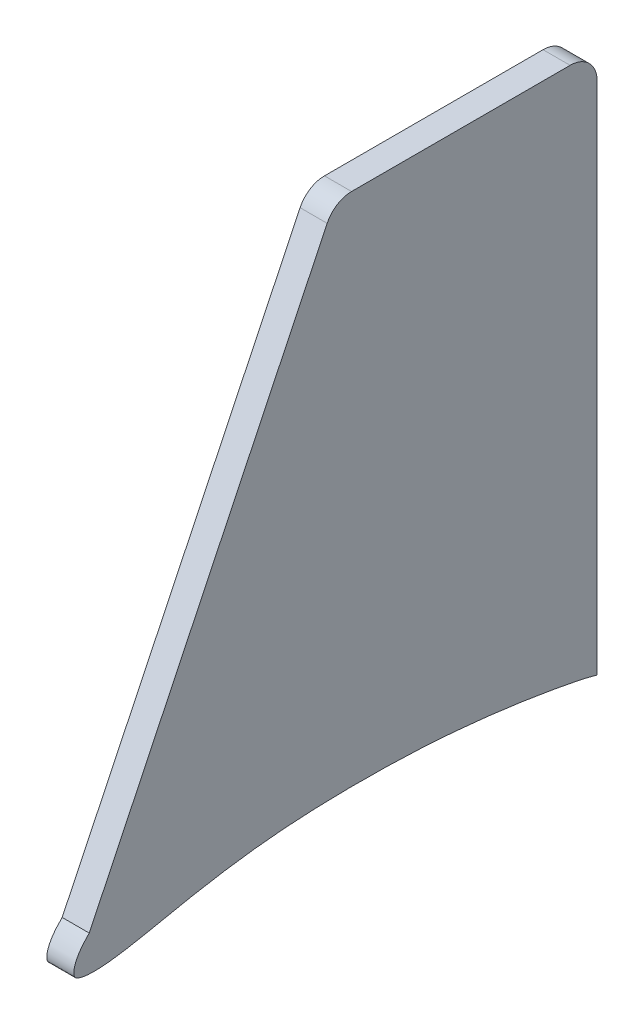
ISO-10303-21;
HEADER;
FILE_DESCRIPTION(('STEP AP214'),'2;1');
FILE_NAME('part.step','',(''),(''),'','','');
FILE_SCHEMA(('AUTOMOTIVE_DESIGN { 1 0 10303 214 1 1 1 1 }'));
ENDSEC;
DATA;
#1=APPLICATION_CONTEXT('core data for automotive mechanical design processes');
#2=APPLICATION_PROTOCOL_DEFINITION('international standard','automotive_design',2000,#1);
#3=PRODUCT_CONTEXT('',#1,'mechanical');
#4=PRODUCT('Part','Part','',(#3));
#5=PRODUCT_RELATED_PRODUCT_CATEGORY('part','',(#4));
#6=PRODUCT_DEFINITION_FORMATION('','',#4);
#7=PRODUCT_DEFINITION_CONTEXT('part definition',#1,'design');
#8=PRODUCT_DEFINITION('design','',#6,#7);
#9=PRODUCT_DEFINITION_SHAPE('','',#8);
#10=(LENGTH_UNIT() NAMED_UNIT(*) SI_UNIT(.MILLI.,.METRE.));
#11=(NAMED_UNIT(*) PLANE_ANGLE_UNIT() SI_UNIT($,.RADIAN.));
#12=(NAMED_UNIT(*) SI_UNIT($,.STERADIAN.) SOLID_ANGLE_UNIT());
#13=UNCERTAINTY_MEASURE_WITH_UNIT(LENGTH_MEASURE(1.E-05),#10,'distance_accuracy_value','');
#14=(GEOMETRIC_REPRESENTATION_CONTEXT(3) GLOBAL_UNCERTAINTY_ASSIGNED_CONTEXT((#13)) GLOBAL_UNIT_ASSIGNED_CONTEXT((#10,
#11,#12)) REPRESENTATION_CONTEXT('',''));
#15=CARTESIAN_POINT('',(0.,0.,0.));
#16=DIRECTION('',(0.,0.,1.));
#17=DIRECTION('',(1.,0.,0.));
#18=AXIS2_PLACEMENT_3D('',#15,#16,#17);
#19=CARTESIAN_POINT('',(10.,75.2925877763329,156.85955786736));
#20=DIRECTION('',(0.,0.432731067584771,0.901523057468274));
#21=DIRECTION('',(0.,-0.901523057468274,0.432731067584771));
#22=AXIS2_PLACEMENT_3D('',#19,#20,#21);
#23=PLANE('',#22);
#24=DIRECTION('',(0.,0.901523057468274,-0.432731067584771));
#25=VECTOR('',#24,1.);
#26=CARTESIAN_POINT('',(10.,75.2925877763329,156.85955786736));
#27=LINE('',#26,#25);
#28=CARTESIAN_POINT('',(10.,11.2681467861031,187.59128954267));
#29=VERTEX_POINT('',#28);
#30=CARTESIAN_POINT('',(10.,194.327310675848,99.7228908755931));
#31=VERTEX_POINT('',#30);
#32=EDGE_CURVE('E95',#29,#31,#27,.T.);
#33=ORIENTED_EDGE('',*,*,#32,.T.);
#34=DIRECTION('',(-1.,0.,0.));
#35=VECTOR('',#34,1.);
#36=CARTESIAN_POINT('',(10.,194.327310675848,99.7228908755931));
#37=LINE('',#36,#35);
#38=CARTESIAN_POINT('',(0.,194.327310675848,99.7228908755931));
#39=VERTEX_POINT('',#38);
#40=EDGE_CURVE('E102',#31,#39,#37,.T.);
#41=ORIENTED_EDGE('',*,*,#40,.T.);
#42=DIRECTION('',(0.,0.901523057468274,-0.432731067584771));
#43=VECTOR('',#42,1.);
#44=CARTESIAN_POINT('',(0.,75.2925877763329,156.85955786736));
#45=LINE('',#44,#43);
#46=CARTESIAN_POINT('',(0.,11.2681467861031,187.59128954267));
#47=VERTEX_POINT('',#46);
#48=EDGE_CURVE('E98',#47,#39,#45,.T.);
#49=ORIENTED_EDGE('',*,*,#48,.F.);
#50=DIRECTION('',(-1.,0.,0.));
#51=VECTOR('',#50,1.);
#52=CARTESIAN_POINT('',(10.,11.2681467861031,187.59128954267));
#53=LINE('',#52,#51);
#54=EDGE_CURVE('E91',#29,#47,#53,.T.);
#55=ORIENTED_EDGE('',*,*,#54,.F.);
#56=EDGE_LOOP('',(#33,#41,#49,#55));
#57=FACE_BOUND('',#56,.T.);
#58=ADVANCED_FACE('F40',(#57),#23,.T.);
#59=CARTESIAN_POINT('',(10.,0.,0.));
#60=CARTESIAN_POINT('',(10.,0.0174190959745839,-0.00407714371903684));
#61=CARTESIAN_POINT('',(10.,0.607421822394285,1.37414501702292));
#62=CARTESIAN_POINT('',(10.,1.36232439006793,2.63088065075289));
#63=CARTESIAN_POINT('',(10.,2.96504299996444,5.4838578528166));
#64=CARTESIAN_POINT('',(10.,4.79476251699968,8.78370402040452));
#65=CARTESIAN_POINT('',(10.,6.75282617590406,13.0430151019742));
#66=CARTESIAN_POINT('',(10.,8.72395925966791,18.10900065829));
#67=CARTESIAN_POINT('',(10.,10.8251436579092,23.9971548208028));
#68=CARTESIAN_POINT('',(10.,13.0457575387963,30.6217003634416));
#69=CARTESIAN_POINT('',(10.,15.3571404896563,37.8892749602272));
#70=CARTESIAN_POINT('',(10.,17.7213364969519,45.6904730717287));
#71=CARTESIAN_POINT('',(10.,20.0851406806537,53.9173796660215));
#72=CARTESIAN_POINT('',(10.,22.3980097915589,62.4582103465091));
#73=CARTESIAN_POINT('',(10.,24.5977434953955,71.2039246502097));
#74=CARTESIAN_POINT('',(10.,26.6122813265505,80.049736570398));
#75=CARTESIAN_POINT('',(10.,28.3804546581324,88.8918998064518));
#76=CARTESIAN_POINT('',(10.,29.8142625452182,97.6588870551647));
#77=CARTESIAN_POINT('',(10.,30.791357051673,106.314527338144));
#78=CARTESIAN_POINT('',(10.,31.2953422528809,114.826394187963));
#79=CARTESIAN_POINT('',(10.,31.335630260437,123.163795755358));
#80=CARTESIAN_POINT('',(10.,30.9310419163404,131.281663953385));
#81=CARTESIAN_POINT('',(10.,30.1037716250908,139.132511468695));
#82=CARTESIAN_POINT('',(10.,28.8851096679994,146.660501660136));
#83=CARTESIAN_POINT('',(10.,27.3317913072314,153.809506697865));
#84=CARTESIAN_POINT('',(10.,25.4841061865597,160.515394682061));
#85=CARTESIAN_POINT('',(10.,23.3773088615761,166.714678069596));
#86=CARTESIAN_POINT('',(10.,21.0540752184588,172.35294727587));
#87=CARTESIAN_POINT('',(10.,18.557343437731,177.381769569209));
#88=CARTESIAN_POINT('',(10.,15.9344962186062,181.762710434912));
#89=CARTESIAN_POINT('',(10.,13.2361200577764,185.463103292678));
#90=CARTESIAN_POINT('',(10.,10.5193182015214,188.462880743187));
#91=CARTESIAN_POINT('',(10.,7.84943029676281,190.750303118235));
#92=CARTESIAN_POINT('',(10.,5.29222711376051,192.319447203867));
#93=CARTESIAN_POINT('',(10.,3.08590093343852,193.121118693578));
#94=CARTESIAN_POINT('',(10.,1.55996618528421,193.299910312504));
#95=CARTESIAN_POINT('',(10.,0.756976121289861,193.217116113944));
#96=CARTESIAN_POINT('',(10.,0.364638658655936,193.135168354058));
#97=CARTESIAN_POINT('',(10.,0.109527208372981,193.047057743484));
#98=CARTESIAN_POINT('',(10.,-0.0800811716018132,192.966394419836));
#99=CARTESIAN_POINT('',(10.,-0.209169578019946,192.894481627869));
#100=CARTESIAN_POINT('',(10.,-0.329399450383564,192.813199568795));
#101=CARTESIAN_POINT('',(10.,-0.43597086073374,192.711052749036));
#102=CARTESIAN_POINT('',(10.,-0.536050789883095,192.594950193723));
#103=CARTESIAN_POINT('',(10.,-0.673000911409007,192.418624978665));
#104=CARTESIAN_POINT('',(10.,-0.827368923123799,192.159205484576));
#105=CARTESIAN_POINT('',(10.,-1.03251089609585,191.743541908128));
#106=CARTESIAN_POINT('',(10.,-1.22699110743402,191.230986192988));
#107=CARTESIAN_POINT('',(10.,-1.63436363817717,189.878130350824));
#108=CARTESIAN_POINT('',(10.,-1.93110109618779,187.356289930799));
#109=CARTESIAN_POINT('',(10.,-1.90683346347817,183.363397329));
#110=CARTESIAN_POINT('',(10.,-1.41461809284013,178.337477563979));
#111=CARTESIAN_POINT('',(10.,-0.457528264755493,172.251379162561));
#112=CARTESIAN_POINT('',(10.,0.971756922138531,165.044779770114));
#113=CARTESIAN_POINT('',(10.,2.74811629383378,156.672519985188));
#114=CARTESIAN_POINT('',(10.,4.61308879179628,147.132421676488));
#115=CARTESIAN_POINT('',(10.,6.39203695650934,136.538925286674));
#116=CARTESIAN_POINT('',(10.,7.92174047421337,125.088731716923));
#117=CARTESIAN_POINT('',(10.,8.99080061220407,113.043379815855));
#118=CARTESIAN_POINT('',(10.,9.55733684790736,100.716484719943));
#119=CARTESIAN_POINT('',(10.,9.74038955282519,88.385603014828));
#120=CARTESIAN_POINT('',(10.,9.58838817546874,76.2557060968319));
#121=CARTESIAN_POINT('',(10.,9.12006090486469,64.5103874842244));
#122=CARTESIAN_POINT('',(10.,8.33847265085059,53.3449602853407));
#123=CARTESIAN_POINT('',(10.,7.31262326988527,42.9480175489173));
#124=CARTESIAN_POINT('',(10.,6.15361423460021,33.4762605328923));
#125=CARTESIAN_POINT('',(10.,4.94069271412634,25.0385271539061));
#126=CARTESIAN_POINT('',(10.,3.7510480396046,17.7565857097068));
#127=CARTESIAN_POINT('',(10.,2.62916244620691,11.6114436019862));
#128=CARTESIAN_POINT('',(10.,1.71287727040228,6.90903054567969));
#129=CARTESIAN_POINT('',(10.,0.815909005958951,3.10097836598117));
#130=CARTESIAN_POINT('',(10.,0.474452697505223,1.51759986978546));
#131=CARTESIAN_POINT('',(10.,-0.0176928266354939,0.00414121359079917));
#132=CARTESIAN_POINT('',(10.,0.,0.));
#133=B_SPLINE_CURVE_WITH_KNOTS('',3,(#59,#60,#61,#62,#63,#64,#65,#66,#67,#68,#69,#70,#71,#72,
#73,#74,#75,#76,#77,#78,#79,#80,#81,#82,#83,#84,#85,#86,#87,#88,#89,#90,#91,#92,#93,#94,#95,#96,
#97,#98,#99,#100,#101,#102,#103,#104,#105,#106,#107,#108,#109,#110,#111,#112,#113,#114,#115,
#116,#117,#118,#119,#120,#121,#122,#123,#124,#125,#126,#127,#128,#129,#130,#131,#132),
.UNSPECIFIED.,.T.,.F.,(4,1,1,1,1,1,1,1,1,1,1,1,1,1,1,1,1,1,1,1,1,1,1,1,1,1,1,1,1,1,1,1,1,1,1,1,
1,1,1,1,1,1,1,1,1,1,1,1,1,1,1,1,1,1,1,1,1,1,1,1,1,1,1,1,1,1,1,1,1,1,1,4),(0.,
0.00181269083986937,0.00691132818594441,0.0145763479799134,0.0241721425987602,
0.0355722423861041,0.0490130798742536,0.0645126154092556,0.0818492807845008,0.100772138867029,
0.120997345003029,0.142228397238218,0.164173399138367,0.186536733717266,0.209022726583481,
0.23136704917421,0.253319655321189,0.274803883382964,0.295858284613002,0.316448577885417,
0.336530716162372,0.356033369912999,0.374893008348198,0.392989986394063,0.410197086513065,
0.426388180513942,0.441458696241048,0.455334221948155,0.467938119319007,0.47923588288511,
0.48920358966339,0.49785058582327,0.505193934109623,0.511308341453314,0.515097162688709,
0.516441428370595,0.517272652153295,0.518060388230321,0.518436361872788,0.518797413487224,
0.51915354396583,0.519507976057524,0.519886845560303,0.520288640685519,0.521160208282761,
0.522116283074934,0.523720315269416,0.525213520373473,0.532574603778874,0.542380647714597,
0.554776210541447,0.569931279880433,0.588004892771993,0.609187964615987,0.633328519690214,
0.660001246569211,0.688743433631073,0.718873444095569,0.749542512962399,0.780126843830021,
0.810208989839181,0.839387287999329,0.867183375921287,0.893104480747204,0.916760446786928,
0.937874172530774,0.956198631563302,0.971543675187949,0.983762849315331,0.992691515667786,
0.998158823809206,1.),.UNSPECIFIED.);
#134=DIRECTION('',(-1.,0.,0.));
#135=VECTOR('',#134,1.);
#136=SURFACE_OF_LINEAR_EXTRUSION('',#133,#135);
#137=CARTESIAN_POINT('',(0.,0.,0.));
#138=CARTESIAN_POINT('',(0.,0.0174190959745839,-0.00407714371903684));
#139=CARTESIAN_POINT('',(0.,0.607421822394285,1.37414501702292));
#140=CARTESIAN_POINT('',(0.,1.36232439006793,2.63088065075289));
#141=CARTESIAN_POINT('',(0.,2.96504299996444,5.4838578528166));
#142=CARTESIAN_POINT('',(0.,4.79476251699968,8.78370402040452));
#143=CARTESIAN_POINT('',(0.,6.75282617590406,13.0430151019742));
#144=CARTESIAN_POINT('',(0.,8.72395925966791,18.10900065829));
#145=CARTESIAN_POINT('',(0.,10.8251436579092,23.9971548208028));
#146=CARTESIAN_POINT('',(0.,13.0457575387963,30.6217003634416));
#147=CARTESIAN_POINT('',(0.,15.3571404896563,37.8892749602272));
#148=CARTESIAN_POINT('',(0.,17.7213364969519,45.6904730717287));
#149=CARTESIAN_POINT('',(0.,20.0851406806537,53.9173796660215));
#150=CARTESIAN_POINT('',(0.,22.3980097915589,62.4582103465091));
#151=CARTESIAN_POINT('',(0.,24.5977434953955,71.2039246502097));
#152=CARTESIAN_POINT('',(0.,26.6122813265505,80.049736570398));
#153=CARTESIAN_POINT('',(0.,28.3804546581324,88.8918998064518));
#154=CARTESIAN_POINT('',(0.,29.8142625452182,97.6588870551647));
#155=CARTESIAN_POINT('',(0.,30.791357051673,106.314527338144));
#156=CARTESIAN_POINT('',(0.,31.2953422528809,114.826394187963));
#157=CARTESIAN_POINT('',(0.,31.335630260437,123.163795755358));
#158=CARTESIAN_POINT('',(0.,30.9310419163404,131.281663953385));
#159=CARTESIAN_POINT('',(0.,30.1037716250908,139.132511468695));
#160=CARTESIAN_POINT('',(0.,28.8851096679994,146.660501660136));
#161=CARTESIAN_POINT('',(0.,27.3317913072314,153.809506697865));
#162=CARTESIAN_POINT('',(0.,25.4841061865597,160.515394682061));
#163=CARTESIAN_POINT('',(0.,23.3773088615761,166.714678069596));
#164=CARTESIAN_POINT('',(0.,21.0540752184588,172.35294727587));
#165=CARTESIAN_POINT('',(0.,18.557343437731,177.381769569209));
#166=CARTESIAN_POINT('',(0.,15.9344962186062,181.762710434912));
#167=CARTESIAN_POINT('',(0.,13.2361200577764,185.463103292678));
#168=CARTESIAN_POINT('',(0.,10.5193182015214,188.462880743187));
#169=CARTESIAN_POINT('',(0.,7.84943029676281,190.750303118235));
#170=CARTESIAN_POINT('',(0.,5.29222711376051,192.319447203867));
#171=CARTESIAN_POINT('',(0.,3.08590093343852,193.121118693578));
#172=CARTESIAN_POINT('',(0.,1.55996618528421,193.299910312504));
#173=CARTESIAN_POINT('',(0.,0.756976121289861,193.217116113944));
#174=CARTESIAN_POINT('',(0.,0.364638658655936,193.135168354058));
#175=CARTESIAN_POINT('',(0.,0.109527208372981,193.047057743484));
#176=CARTESIAN_POINT('',(0.,-0.0800811716018132,192.966394419836));
#177=CARTESIAN_POINT('',(0.,-0.209169578019946,192.894481627869));
#178=CARTESIAN_POINT('',(0.,-0.329399450383564,192.813199568795));
#179=CARTESIAN_POINT('',(0.,-0.43597086073374,192.711052749036));
#180=CARTESIAN_POINT('',(0.,-0.536050789883095,192.594950193723));
#181=CARTESIAN_POINT('',(0.,-0.673000911409007,192.418624978665));
#182=CARTESIAN_POINT('',(0.,-0.827368923123799,192.159205484576));
#183=CARTESIAN_POINT('',(0.,-1.03251089609585,191.743541908128));
#184=CARTESIAN_POINT('',(0.,-1.22699110743402,191.230986192988));
#185=CARTESIAN_POINT('',(0.,-1.63436363817717,189.878130350824));
#186=CARTESIAN_POINT('',(0.,-1.93110109618779,187.356289930799));
#187=CARTESIAN_POINT('',(0.,-1.90683346347817,183.363397329));
#188=CARTESIAN_POINT('',(0.,-1.41461809284013,178.337477563979));
#189=CARTESIAN_POINT('',(0.,-0.457528264755493,172.251379162561));
#190=CARTESIAN_POINT('',(0.,0.971756922138531,165.044779770114));
#191=CARTESIAN_POINT('',(0.,2.74811629383378,156.672519985188));
#192=CARTESIAN_POINT('',(0.,4.61308879179628,147.132421676488));
#193=CARTESIAN_POINT('',(0.,6.39203695650934,136.538925286674));
#194=CARTESIAN_POINT('',(0.,7.92174047421337,125.088731716923));
#195=CARTESIAN_POINT('',(0.,8.99080061220407,113.043379815855));
#196=CARTESIAN_POINT('',(0.,9.55733684790736,100.716484719943));
#197=CARTESIAN_POINT('',(0.,9.74038955282519,88.385603014828));
#198=CARTESIAN_POINT('',(0.,9.58838817546874,76.2557060968319));
#199=CARTESIAN_POINT('',(0.,9.12006090486469,64.5103874842244));
#200=CARTESIAN_POINT('',(0.,8.33847265085059,53.3449602853407));
#201=CARTESIAN_POINT('',(0.,7.31262326988527,42.9480175489173));
#202=CARTESIAN_POINT('',(0.,6.15361423460021,33.4762605328923));
#203=CARTESIAN_POINT('',(0.,4.94069271412634,25.0385271539061));
#204=CARTESIAN_POINT('',(0.,3.7510480396046,17.7565857097068));
#205=CARTESIAN_POINT('',(0.,2.62916244620691,11.6114436019862));
#206=CARTESIAN_POINT('',(0.,1.71287727040228,6.90903054567969));
#207=CARTESIAN_POINT('',(0.,0.815909005958951,3.10097836598117));
#208=CARTESIAN_POINT('',(0.,0.474452697505223,1.51759986978546));
#209=CARTESIAN_POINT('',(0.,-0.0176928266354939,0.00414121359079917));
#210=CARTESIAN_POINT('',(0.,0.,0.));
#211=B_SPLINE_CURVE_WITH_KNOTS('',3,(#137,#138,#139,#140,#141,#142,#143,#144,#145,#146,#147,
#148,#149,#150,#151,#152,#153,#154,#155,#156,#157,#158,#159,#160,#161,#162,#163,#164,#165,#166,
#167,#168,#169,#170,#171,#172,#173,#174,#175,#176,#177,#178,#179,#180,#181,#182,#183,#184,#185,
#186,#187,#188,#189,#190,#191,#192,#193,#194,#195,#196,#197,#198,#199,#200,#201,#202,#203,#204,
#205,#206,#207,#208,#209,#210),.UNSPECIFIED.,.T.,.F.,(4,1,1,1,1,1,1,1,1,1,1,1,1,1,1,1,1,1,1,1,1,
1,1,1,1,1,1,1,1,1,1,1,1,1,1,1,1,1,1,1,1,1,1,1,1,1,1,1,1,1,1,1,1,1,1,1,1,1,1,1,1,1,1,1,1,1,1,1,1,
1,1,4),(0.,0.00181269083986937,0.00691132818594441,0.0145763479799134,0.0241721425987602,
0.0355722423861041,0.0490130798742536,0.0645126154092556,0.0818492807845008,0.100772138867029,
0.120997345003029,0.142228397238218,0.164173399138367,0.186536733717266,0.209022726583481,
0.23136704917421,0.253319655321189,0.274803883382964,0.295858284613002,0.316448577885417,
0.336530716162372,0.356033369912999,0.374893008348198,0.392989986394063,0.410197086513065,
0.426388180513942,0.441458696241048,0.455334221948155,0.467938119319007,0.47923588288511,
0.48920358966339,0.49785058582327,0.505193934109623,0.511308341453314,0.515097162688709,
0.516441428370595,0.517272652153295,0.518060388230321,0.518436361872788,0.518797413487224,
0.51915354396583,0.519507976057524,0.519886845560303,0.520288640685519,0.521160208282761,
0.522116283074934,0.523720315269416,0.525213520373473,0.532574603778874,0.542380647714597,
0.554776210541447,0.569931279880433,0.588004892771993,0.609187964615987,0.633328519690214,
0.660001246569211,0.688743433631073,0.718873444095569,0.749542512962399,0.780126843830021,
0.810208989839181,0.839387287999329,0.867183375921287,0.893104480747204,0.916760446786928,
0.937874172530774,0.956198631563302,0.971543675187949,0.983762849315331,0.992691515667786,
0.998158823809206,1.),.UNSPECIFIED.);
#212=CARTESIAN_POINT('',(0.,0.,0.));
#213=VERTEX_POINT('',#212);
#214=EDGE_CURVE('E162',#47,#213,#211,.T.);
#215=ORIENTED_EDGE('',*,*,#214,.T.);
#216=DIRECTION('',(-1.,0.,0.));
#217=VECTOR('',#216,1.);
#218=CARTESIAN_POINT('',(10.,0.,0.));
#219=LINE('',#218,#217);
#220=CARTESIAN_POINT('',(10.,0.,0.));
#221=VERTEX_POINT('',#220);
#222=EDGE_CURVE('E103',#221,#213,#219,.T.);
#223=ORIENTED_EDGE('',*,*,#222,.F.);
#224=EDGE_CURVE('E107',#29,#221,#133,.T.);
#225=ORIENTED_EDGE('',*,*,#224,.F.);
#226=ORIENTED_EDGE('',*,*,#54,.T.);
#227=EDGE_LOOP('',(#215,#223,#225,#226));
#228=FACE_BOUND('',#227,.T.);
#229=ADVANCED_FACE('F108',(#228),#136,.F.);
#230=CARTESIAN_POINT('',(10.,0.,0.));
#231=DIRECTION('',(0.,0.,-1.));
#232=DIRECTION('',(0.,1.,0.));
#233=AXIS2_PLACEMENT_3D('',#230,#231,#232);
#234=PLANE('',#233);
#235=DIRECTION('',(0.,-1.,0.));
#236=VECTOR('',#235,1.);
#237=CARTESIAN_POINT('',(0.,0.,0.));
#238=LINE('',#237,#236);
#239=CARTESIAN_POINT('',(0.,190.,0.));
#240=VERTEX_POINT('',#239);
#241=EDGE_CURVE('E119',#240,#213,#238,.T.);
#242=ORIENTED_EDGE('',*,*,#241,.F.);
#243=DIRECTION('',(-1.,0.,0.));
#244=VECTOR('',#243,1.);
#245=CARTESIAN_POINT('',(10.,190.,0.));
#246=LINE('',#245,#244);
#247=CARTESIAN_POINT('',(10.,190.,0.));
#248=VERTEX_POINT('',#247);
#249=EDGE_CURVE('E48',#240,#248,#246,.F.);
#250=ORIENTED_EDGE('',*,*,#249,.T.);
#251=DIRECTION('',(0.,-1.,0.));
#252=VECTOR('',#251,1.);
#253=CARTESIAN_POINT('',(10.,0.,0.));
#254=LINE('',#253,#252);
#255=EDGE_CURVE('E111',#248,#221,#254,.T.);
#256=ORIENTED_EDGE('',*,*,#255,.T.);
#257=ORIENTED_EDGE('',*,*,#222,.T.);
#258=EDGE_LOOP('',(#242,#250,#256,#257));
#259=FACE_BOUND('',#258,.T.);
#260=ADVANCED_FACE('F133',(#259),#234,.T.);
#261=CARTESIAN_POINT('',(10.,200.,0.));
#262=DIRECTION('',(0.,1.,0.));
#263=DIRECTION('',(0.,0.,1.));
#264=AXIS2_PLACEMENT_3D('',#261,#262,#263);
#265=PLANE('',#264);
#266=DIRECTION('',(0.,0.,-1.));
#267=VECTOR('',#266,1.);
#268=CARTESIAN_POINT('',(10.,200.,0.));
#269=LINE('',#268,#267);
#270=CARTESIAN_POINT('',(10.,200.,90.7076603009104));
#271=VERTEX_POINT('',#270);
#272=CARTESIAN_POINT('',(10.,200.,10.));
#273=VERTEX_POINT('',#272);
#274=EDGE_CURVE('E159',#271,#273,#269,.T.);
#275=ORIENTED_EDGE('',*,*,#274,.T.);
#276=DIRECTION('',(-1.,0.,0.));
#277=VECTOR('',#276,1.);
#278=CARTESIAN_POINT('',(10.,200.,10.));
#279=LINE('',#278,#277);
#280=CARTESIAN_POINT('',(0.,200.,10.));
#281=VERTEX_POINT('',#280);
#282=EDGE_CURVE('E149',#273,#281,#279,.T.);
#283=ORIENTED_EDGE('',*,*,#282,.T.);
#284=DIRECTION('',(0.,0.,-1.));
#285=VECTOR('',#284,1.);
#286=CARTESIAN_POINT('',(0.,200.,0.));
#287=LINE('',#286,#285);
#288=CARTESIAN_POINT('',(0.,200.,90.7076603009104));
#289=VERTEX_POINT('',#288);
#290=EDGE_CURVE('E117',#289,#281,#287,.T.);
#291=ORIENTED_EDGE('',*,*,#290,.F.);
#292=DIRECTION('',(-1.,0.,0.));
#293=VECTOR('',#292,1.);
#294=CARTESIAN_POINT('',(10.,200.,90.7076603009104));
#295=LINE('',#294,#293);
#296=EDGE_CURVE('E148',#289,#271,#295,.F.);
#297=ORIENTED_EDGE('',*,*,#296,.T.);
#298=EDGE_LOOP('',(#275,#283,#291,#297));
#299=FACE_BOUND('',#298,.T.);
#300=ADVANCED_FACE('F174',(#299),#265,.T.);
#301=CARTESIAN_POINT('',(10.,0.,0.));
#302=DIRECTION('',(1.,0.,0.));
#303=DIRECTION('',(0.,0.,-1.));
#304=AXIS2_PLACEMENT_3D('',#301,#302,#303);
#305=PLANE('',#304);
#306=ORIENTED_EDGE('',*,*,#255,.F.);
#307=CARTESIAN_POINT('',(10.,190.,10.));
#308=DIRECTION('',(1.,0.,0.));
#309=DIRECTION('',(0.,0.,-1.));
#310=AXIS2_PLACEMENT_3D('',#307,#308,#309);
#311=CIRCLE('',#310,10.);
#312=EDGE_CURVE('E11',#248,#273,#311,.T.);
#313=ORIENTED_EDGE('',*,*,#312,.T.);
#314=ORIENTED_EDGE('',*,*,#274,.F.);
#315=CARTESIAN_POINT('',(10.,190.,90.7076603009104));
#316=DIRECTION('',(1.,0.,0.));
#317=DIRECTION('',(0.,0.,-1.));
#318=AXIS2_PLACEMENT_3D('',#315,#316,#317);
#319=CIRCLE('',#318,10.);
#320=EDGE_CURVE('E116',#271,#31,#319,.T.);
#321=ORIENTED_EDGE('',*,*,#320,.T.);
#322=ORIENTED_EDGE('',*,*,#32,.F.);
#323=ORIENTED_EDGE('',*,*,#224,.T.);
#324=EDGE_LOOP('',(#306,#313,#314,#321,#322,#323));
#325=FACE_BOUND('',#324,.T.);
#326=ADVANCED_FACE('F113',(#325),#305,.T.);
#327=CARTESIAN_POINT('',(0.,0.,0.));
#328=DIRECTION('',(1.,0.,0.));
#329=DIRECTION('',(0.,0.,-1.));
#330=AXIS2_PLACEMENT_3D('',#327,#328,#329);
#331=PLANE('',#330);
#332=ORIENTED_EDGE('',*,*,#290,.T.);
#333=CARTESIAN_POINT('',(0.,190.,10.));
#334=DIRECTION('',(1.,0.,0.));
#335=DIRECTION('',(0.,0.,-1.));
#336=AXIS2_PLACEMENT_3D('',#333,#334,#335);
#337=CIRCLE('',#336,10.);
#338=EDGE_CURVE('E62',#281,#240,#337,.F.);
#339=ORIENTED_EDGE('',*,*,#338,.T.);
#340=ORIENTED_EDGE('',*,*,#241,.T.);
#341=ORIENTED_EDGE('',*,*,#214,.F.);
#342=ORIENTED_EDGE('',*,*,#48,.T.);
#343=CARTESIAN_POINT('',(0.,190.,90.7076603009104));
#344=DIRECTION('',(1.,0.,0.));
#345=DIRECTION('',(0.,0.,-1.));
#346=AXIS2_PLACEMENT_3D('',#343,#344,#345);
#347=CIRCLE('',#346,10.);
#348=EDGE_CURVE('E153',#39,#289,#347,.F.);
#349=ORIENTED_EDGE('',*,*,#348,.T.);
#350=EDGE_LOOP('',(#332,#339,#340,#341,#342,#349));
#351=FACE_BOUND('',#350,.T.);
#352=ADVANCED_FACE('F138',(#351),#331,.F.);
#353=CARTESIAN_POINT('',(10.,190.,90.7076603009104));
#354=DIRECTION('',(-1.,0.,0.));
#355=DIRECTION('',(0.,0.,1.));
#356=AXIS2_PLACEMENT_3D('',#353,#354,#355);
#357=CYLINDRICAL_SURFACE('',#356,10.);
#358=ORIENTED_EDGE('',*,*,#320,.F.);
#359=ORIENTED_EDGE('',*,*,#296,.F.);
#360=ORIENTED_EDGE('',*,*,#348,.F.);
#361=ORIENTED_EDGE('',*,*,#40,.F.);
#362=EDGE_LOOP('',(#358,#359,#360,#361));
#363=FACE_BOUND('',#362,.T.);
#364=ADVANCED_FACE('F136',(#363),#357,.T.);
#365=CARTESIAN_POINT('',(10.,190.,10.));
#366=DIRECTION('',(-1.,0.,0.));
#367=DIRECTION('',(0.,0.,1.));
#368=AXIS2_PLACEMENT_3D('',#365,#366,#367);
#369=CYLINDRICAL_SURFACE('',#368,10.);
#370=ORIENTED_EDGE('',*,*,#312,.F.);
#371=ORIENTED_EDGE('',*,*,#249,.F.);
#372=ORIENTED_EDGE('',*,*,#338,.F.);
#373=ORIENTED_EDGE('',*,*,#282,.F.);
#374=EDGE_LOOP('',(#370,#371,#372,#373));
#375=FACE_BOUND('',#374,.T.);
#376=ADVANCED_FACE('F42',(#375),#369,.T.);
#377=CLOSED_SHELL('',(#58,#229,#260,#300,#326,#352,#364,#376));
#378=MANIFOLD_SOLID_BREP('B2',#377);
#379=ADVANCED_BREP_SHAPE_REPRESENTATION('',(#18,#378),#14);
#380=SHAPE_DEFINITION_REPRESENTATION(#9,#379);
ENDSEC;
END-ISO-10303-21;
